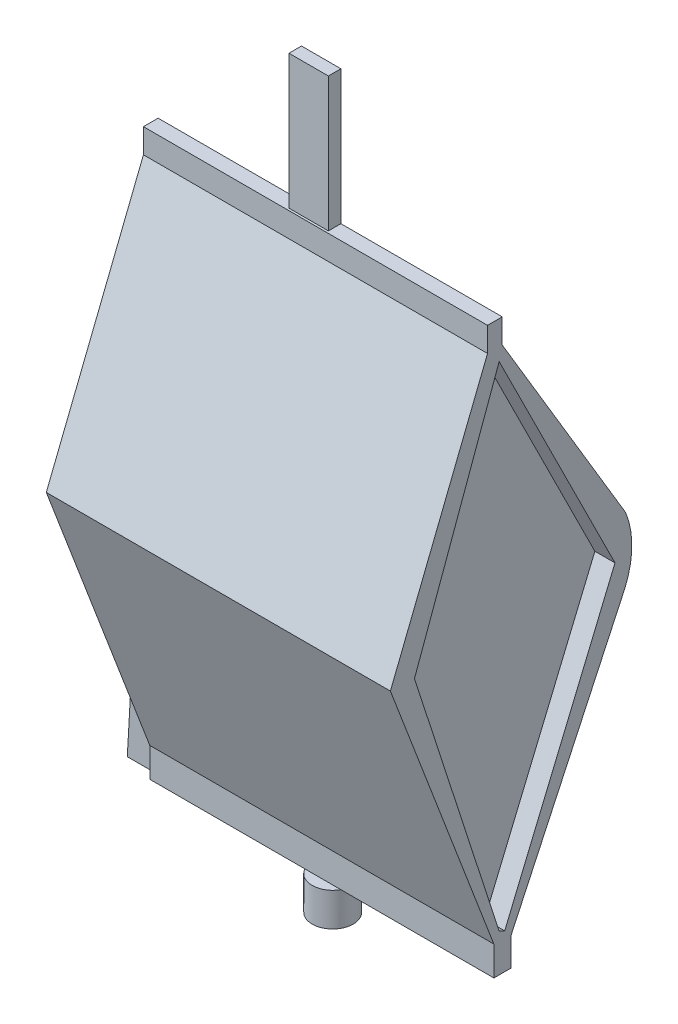
ISO-10303-21;
HEADER;
FILE_DESCRIPTION(('STEP AP214'),'2;1');
FILE_NAME('part.step','',(''),(''),'','','');
FILE_SCHEMA(('AUTOMOTIVE_DESIGN { 1 0 10303 214 1 1 1 1 }'));
ENDSEC;
DATA;
#1=APPLICATION_CONTEXT('core data for automotive mechanical design processes');
#2=APPLICATION_PROTOCOL_DEFINITION('international standard','automotive_design',2000,#1);
#3=PRODUCT_CONTEXT('',#1,'mechanical');
#4=PRODUCT('Part','Part','',(#3));
#5=PRODUCT_RELATED_PRODUCT_CATEGORY('part','',(#4));
#6=PRODUCT_DEFINITION_FORMATION('','',#4);
#7=PRODUCT_DEFINITION_CONTEXT('part definition',#1,'design');
#8=PRODUCT_DEFINITION('design','',#6,#7);
#9=PRODUCT_DEFINITION_SHAPE('','',#8);
#10=(LENGTH_UNIT() NAMED_UNIT(*) SI_UNIT(.MILLI.,.METRE.));
#11=(NAMED_UNIT(*) PLANE_ANGLE_UNIT() SI_UNIT($,.RADIAN.));
#12=(NAMED_UNIT(*) SI_UNIT($,.STERADIAN.) SOLID_ANGLE_UNIT());
#13=UNCERTAINTY_MEASURE_WITH_UNIT(LENGTH_MEASURE(1.E-05),#10,'distance_accuracy_value','');
#14=(GEOMETRIC_REPRESENTATION_CONTEXT(3) GLOBAL_UNCERTAINTY_ASSIGNED_CONTEXT((#13)) GLOBAL_UNIT_ASSIGNED_CONTEXT((#10,
#11,#12)) REPRESENTATION_CONTEXT('',''));
#15=CARTESIAN_POINT('',(0.,0.,0.));
#16=DIRECTION('',(0.,0.,1.));
#17=DIRECTION('',(1.,0.,0.));
#18=AXIS2_PLACEMENT_3D('',#15,#16,#17);
#19=CARTESIAN_POINT('',(-10.1405450074318,-16.383261510201,37.0439177567727));
#20=DIRECTION('',(0.,1.,0.));
#21=DIRECTION('',(0.,0.,1.));
#22=AXIS2_PLACEMENT_3D('',#19,#20,#21);
#23=PLANE('',#22);
#24=CARTESIAN_POINT('',(4.79777891586508,-16.383261510201,28.8175561612292));
#25=DIRECTION('',(0.,-1.,0.));
#26=DIRECTION('',(0.,0.,-1.));
#27=AXIS2_PLACEMENT_3D('',#24,#25,#26);
#28=CIRCLE('',#27,1.22111887593082);
#29=CARTESIAN_POINT('',(5.93599677635128,-16.383261510201,28.3752989835319));
#30=VERTEX_POINT('',#29);
#31=CARTESIAN_POINT('',(5.86924766810465,-16.383261510201,29.4032916152771));
#32=VERTEX_POINT('',#31);
#33=EDGE_CURVE('E44',#30,#32,#28,.T.);
#34=ORIENTED_EDGE('',*,*,#33,.F.);
#35=DIRECTION('',(1.,0.,0.));
#36=VECTOR('',#35,1.);
#37=CARTESIAN_POINT('',(-10.1405450074318,-16.383261510201,28.3752989835319));
#38=LINE('',#37,#36);
#39=CARTESIAN_POINT('',(14.9939474205773,-16.383261510201,28.3752989835319));
#40=VERTEX_POINT('',#39);
#41=EDGE_CURVE('E198',#30,#40,#38,.T.);
#42=ORIENTED_EDGE('',*,*,#41,.T.);
#43=DIRECTION('',(0.,0.,-1.));
#44=VECTOR('',#43,1.);
#45=CARTESIAN_POINT('',(14.9939474205773,-16.383261510201,37.0439177567727));
#46=LINE('',#45,#44);
#47=CARTESIAN_POINT('',(14.9939474205773,-16.383261510201,29.4032916152771));
#48=VERTEX_POINT('',#47);
#49=EDGE_CURVE('E358',#48,#40,#46,.T.);
#50=ORIENTED_EDGE('',*,*,#49,.F.);
#51=DIRECTION('',(1.,0.,0.));
#52=VECTOR('',#51,1.);
#53=CARTESIAN_POINT('',(-17.0060525794227,-16.383261510201,29.4032916152771));
#54=LINE('',#53,#52);
#55=EDGE_CURVE('E52',#32,#48,#54,.T.);
#56=ORIENTED_EDGE('',*,*,#55,.F.);
#57=EDGE_LOOP('',(#34,#42,#50,#56));
#58=FACE_BOUND('',#57,.T.);
#59=ADVANCED_FACE('F34',(#58),#23,.F.);
#60=CARTESIAN_POINT('',(-10.1405450074318,17.5056411192811,37.0439177567727));
#61=DIRECTION('',(0.,-1.,0.));
#62=DIRECTION('',(0.,0.,-1.));
#63=AXIS2_PLACEMENT_3D('',#60,#61,#62);
#64=PLANE('',#63);
#65=DIRECTION('',(0.,0.,1.));
#66=VECTOR('',#65,1.);
#67=CARTESIAN_POINT('',(3.02748880821108,17.5056411192811,29.6523771630587));
#68=LINE('',#67,#66);
#69=CARTESIAN_POINT('',(3.02748880821108,17.5056411192811,28.9060713444781));
#70=VERTEX_POINT('',#69);
#71=CARTESIAN_POINT('',(3.02748880821108,17.5056411192811,29.6523771630587));
#72=VERTEX_POINT('',#71);
#73=EDGE_CURVE('E229',#70,#72,#68,.T.);
#74=ORIENTED_EDGE('',*,*,#73,.F.);
#75=DIRECTION('',(1.,0.,0.));
#76=VECTOR('',#75,1.);
#77=CARTESIAN_POINT('',(-17.0060525794227,17.5056411192811,28.9060713444781));
#78=LINE('',#77,#76);
#79=CARTESIAN_POINT('',(-5.52126211458491,17.5056411192811,28.9060713444781));
#80=VERTEX_POINT('',#79);
#81=EDGE_CURVE('E341',#80,#70,#78,.T.);
#82=ORIENTED_EDGE('',*,*,#81,.F.);
#83=DIRECTION('',(0.,0.,-1.));
#84=VECTOR('',#83,1.);
#85=CARTESIAN_POINT('',(-5.52126211458491,17.5056411192811,60.9060713444781));
#86=LINE('',#85,#84);
#87=CARTESIAN_POINT('',(-5.52126211458491,17.5056411192811,29.7823314594479));
#88=VERTEX_POINT('',#87);
#89=EDGE_CURVE('E265',#88,#80,#86,.T.);
#90=ORIENTED_EDGE('',*,*,#89,.F.);
#91=DIRECTION('',(1.,0.,0.));
#92=VECTOR('',#91,1.);
#93=CARTESIAN_POINT('',(-17.0060525794227,17.5056411192811,29.7823314594479));
#94=LINE('',#93,#92);
#95=CARTESIAN_POINT('',(14.9939474205773,17.5056411192811,29.7823314594479));
#96=VERTEX_POINT('',#95);
#97=EDGE_CURVE('E364',#88,#96,#94,.T.);
#98=ORIENTED_EDGE('',*,*,#97,.T.);
#99=DIRECTION('',(0.,0.,-1.));
#100=VECTOR('',#99,1.);
#101=CARTESIAN_POINT('',(14.9939474205773,17.5056411192811,37.0439177567727));
#102=LINE('',#101,#100);
#103=CARTESIAN_POINT('',(14.9939474205773,17.5056411192811,28.9060713444781));
#104=VERTEX_POINT('',#103);
#105=EDGE_CURVE('E369',#96,#104,#102,.T.);
#106=ORIENTED_EDGE('',*,*,#105,.T.);
#107=CARTESIAN_POINT('',(5.37584407242301,17.5056411192811,28.9060713444781));
#108=VERTEX_POINT('',#107);
#109=EDGE_CURVE('E335',#108,#104,#78,.T.);
#110=ORIENTED_EDGE('',*,*,#109,.F.);
#111=DIRECTION('',(0.,0.,-1.));
#112=VECTOR('',#111,1.);
#113=CARTESIAN_POINT('',(5.37584407242301,17.5056411192811,29.6523771630587));
#114=LINE('',#113,#112);
#115=CARTESIAN_POINT('',(5.37584407242301,17.5056411192811,29.6523771630587));
#116=VERTEX_POINT('',#115);
#117=EDGE_CURVE('E222',#116,#108,#114,.T.);
#118=ORIENTED_EDGE('',*,*,#117,.F.);
#119=DIRECTION('',(1.,0.,0.));
#120=VECTOR('',#119,1.);
#121=CARTESIAN_POINT('',(5.37584407242301,17.5056411192811,29.6523771630587));
#122=LINE('',#121,#120);
#123=EDGE_CURVE('E232',#72,#116,#122,.T.);
#124=ORIENTED_EDGE('',*,*,#123,.F.);
#125=EDGE_LOOP('',(#74,#82,#90,#98,#106,#110,#118,#124));
#126=FACE_BOUND('',#125,.T.);
#127=ADVANCED_FACE('F396',(#126),#64,.F.);
#128=CARTESIAN_POINT('',(14.9939474205773,17.5056411192811,37.0439177567727));
#129=DIRECTION('',(-1.,0.,0.));
#130=DIRECTION('',(0.,0.,1.));
#131=AXIS2_PLACEMENT_3D('',#128,#129,#130);
#132=PLANE('',#131);
#133=DIRECTION('',(0.,-0.939498101775437,0.34255410778496));
#134=VECTOR('',#133,1.);
#135=CARTESIAN_POINT('',(14.9939474205773,15.2881641035008,29.0885573251257));
#136=LINE('',#135,#134);
#137=CARTESIAN_POINT('',(14.9939474205773,15.2881641035008,29.0885573251257));
#138=VERTEX_POINT('',#137);
#139=CARTESIAN_POINT('',(14.9939474205773,1.43957116866305,34.1379474068146));
#140=VERTEX_POINT('',#139);
#141=EDGE_CURVE('E299',#138,#140,#136,.T.);
#142=ORIENTED_EDGE('',*,*,#141,.F.);
#143=DIRECTION('',(0.,0.894888871151744,0.446289041192766));
#144=VECTOR('',#143,1.);
#145=CARTESIAN_POINT('',(14.9939474205773,1.43957116866305,22.1821408280659));
#146=LINE('',#145,#144);
#147=CARTESIAN_POINT('',(14.9939474205773,1.43957116866305,22.1821408280659));
#148=VERTEX_POINT('',#147);
#149=EDGE_CURVE('E280',#148,#138,#146,.T.);
#150=ORIENTED_EDGE('',*,*,#149,.F.);
#151=DIRECTION('',(0.,0.922414525454659,-0.386201298845896));
#152=VECTOR('',#151,1.);
#153=CARTESIAN_POINT('',(14.9939474205773,-14.2700907355062,28.7595435731382));
#154=LINE('',#153,#152);
#155=CARTESIAN_POINT('',(14.9939474205773,-14.2700907355062,28.7595435731382));
#156=VERTEX_POINT('',#155);
#157=EDGE_CURVE('E285',#156,#148,#154,.T.);
#158=ORIENTED_EDGE('',*,*,#157,.F.);
#159=DIRECTION('',(0.,-0.423128591443833,-0.906069641419884));
#160=VECTOR('',#159,1.);
#161=CARTESIAN_POINT('',(14.9939474205773,-14.1164434670402,29.0885573251257));
#162=LINE('',#161,#160);
#163=CARTESIAN_POINT('',(14.9939474205773,-14.1164434670402,29.0885573251257));
#164=VERTEX_POINT('',#163);
#165=EDGE_CURVE('E305',#164,#156,#162,.T.);
#166=ORIENTED_EDGE('',*,*,#165,.F.);
#167=DIRECTION('',(0.,-0.951147499434773,-0.308736836673207));
#168=VECTOR('',#167,1.);
#169=CARTESIAN_POINT('',(14.9939474205773,1.43957116866305,34.1379474068146));
#170=LINE('',#169,#168);
#171=EDGE_CURVE('E302',#140,#164,#170,.T.);
#172=ORIENTED_EDGE('',*,*,#171,.F.);
#173=EDGE_LOOP('',(#142,#150,#158,#166,#172));
#174=FACE_BOUND('',#173,.T.);
#175=DIRECTION('',(0.,-0.906069641419884,0.423128591443834));
#176=VECTOR('',#175,1.);
#177=CARTESIAN_POINT('',(14.9939474205773,2.06125335554348,20.5544841655735));
#178=LINE('',#177,#176);
#179=CARTESIAN_POINT('',(14.9939474205773,-0.14556183020964,21.5850524115874));
#180=VERTEX_POINT('',#179);
#181=CARTESIAN_POINT('',(14.9939474205773,-14.6859081953666,28.3752989835319));
#182=VERTEX_POINT('',#181);
#183=EDGE_CURVE('E330',#180,#182,#178,.T.);
#184=ORIENTED_EDGE('',*,*,#183,.F.);
#185=CARTESIAN_POINT('',(14.9939474205773,1.83319011203404,26.222220961359));
#186=DIRECTION('',(-1.,0.,0.));
#187=DIRECTION('',(0.,0.,1.));
#188=AXIS2_PLACEMENT_3D('',#185,#186,#187);
#189=CIRCLE('',#188,5.04170520835203);
#190=CARTESIAN_POINT('',(14.9939474205773,3.73098867829226,21.5513375320887));
#191=VERTEX_POINT('',#190);
#192=EDGE_CURVE('E312',#180,#191,#189,.F.);
#193=ORIENTED_EDGE('',*,*,#192,.T.);
#194=DIRECTION('',(0.,-0.85862241369767,-0.512608574543957));
#195=VECTOR('',#194,1.);
#196=CARTESIAN_POINT('',(14.9939474205773,16.0502115935854,28.9060713444781));
#197=LINE('',#196,#195);
#198=CARTESIAN_POINT('',(14.9939474205773,16.0502115935854,28.9060713444781));
#199=VERTEX_POINT('',#198);
#200=EDGE_CURVE('E328',#199,#191,#197,.T.);
#201=ORIENTED_EDGE('',*,*,#200,.F.);
#202=DIRECTION('',(0.,-1.,0.));
#203=VECTOR('',#202,1.);
#204=CARTESIAN_POINT('',(14.9939474205773,17.5056411192811,28.9060713444781));
#205=LINE('',#204,#203);
#206=EDGE_CURVE('E325',#104,#199,#205,.T.);
#207=ORIENTED_EDGE('',*,*,#206,.F.);
#208=ORIENTED_EDGE('',*,*,#105,.F.);
#209=DIRECTION('',(0.,-1.,0.));
#210=VECTOR('',#209,1.);
#211=CARTESIAN_POINT('',(14.9939474205773,0.561189804540035,29.7823314594479));
#212=LINE('',#211,#210);
#213=CARTESIAN_POINT('',(14.9939474205773,16.0524594077059,29.7823314594479));
#214=VERTEX_POINT('',#213);
#215=EDGE_CURVE('E346',#96,#214,#212,.T.);
#216=ORIENTED_EDGE('',*,*,#215,.T.);
#217=DIRECTION('',(0.,-0.928999989043887,0.370079748644069));
#218=VECTOR('',#217,1.);
#219=CARTESIAN_POINT('',(14.9939474205773,7.06237754820204,33.3636525295148));
#220=LINE('',#219,#218);
#221=CARTESIAN_POINT('',(14.9939474205773,1.51675664046694,35.5728258511659));
#222=VERTEX_POINT('',#221);
#223=EDGE_CURVE('E338',#214,#222,#220,.T.);
#224=ORIENTED_EDGE('',*,*,#223,.T.);
#225=DIRECTION('',(0.,-0.934146484006521,-0.356889823920849));
#226=VECTOR('',#225,1.);
#227=CARTESIAN_POINT('',(14.9939474205773,-5.49440333280213,32.8942184901351));
#228=LINE('',#227,#226);
#229=CARTESIAN_POINT('',(14.9939474205773,-14.6317808860375,29.4032916152771));
#230=VERTEX_POINT('',#229);
#231=EDGE_CURVE('E352',#222,#230,#228,.T.);
#232=ORIENTED_EDGE('',*,*,#231,.T.);
#233=DIRECTION('',(0.,-1.,0.));
#234=VECTOR('',#233,1.);
#235=CARTESIAN_POINT('',(14.9939474205773,0.561189804540035,29.4032916152771));
#236=LINE('',#235,#234);
#237=EDGE_CURVE('E349',#230,#48,#236,.T.);
#238=ORIENTED_EDGE('',*,*,#237,.T.);
#239=ORIENTED_EDGE('',*,*,#49,.T.);
#240=DIRECTION('',(0.,-1.,0.));
#241=VECTOR('',#240,1.);
#242=CARTESIAN_POINT('',(14.9939474205773,-14.6859081953666,28.3752989835319));
#243=LINE('',#242,#241);
#244=EDGE_CURVE('E333',#182,#40,#243,.T.);
#245=ORIENTED_EDGE('',*,*,#244,.F.);
#246=EDGE_LOOP('',(#184,#193,#201,#207,#208,#216,#224,#232,#238,#239,#245));
#247=FACE_BOUND('',#246,.T.);
#248=ADVANCED_FACE('F36',(#174,#247),#132,.F.);
#249=CARTESIAN_POINT('',(3.72631016362551,-16.383261510201,29.4032916152771));
#250=VERTEX_POINT('',#249);
#251=CARTESIAN_POINT('',(3.65956105537888,-16.383261510201,28.3752989835319));
#252=VERTEX_POINT('',#251);
#253=EDGE_CURVE('E11',#250,#252,#28,.T.);
#254=ORIENTED_EDGE('',*,*,#253,.F.);
#255=CARTESIAN_POINT('',(-5.52126211458491,-16.383261510201,29.4032916152771));
#256=VERTEX_POINT('',#255);
#257=EDGE_CURVE('E361',#256,#250,#54,.T.);
#258=ORIENTED_EDGE('',*,*,#257,.F.);
#259=DIRECTION('',(0.,0.,-1.));
#260=VECTOR('',#259,1.);
#261=CARTESIAN_POINT('',(-5.52126211458491,-16.383261510201,37.0439177567727));
#262=LINE('',#261,#260);
#263=CARTESIAN_POINT('',(-5.52126211458491,-16.383261510201,28.9060713444781));
#264=VERTEX_POINT('',#263);
#265=EDGE_CURVE('E273',#256,#264,#262,.T.);
#266=ORIENTED_EDGE('',*,*,#265,.T.);
#267=DIRECTION('',(1.,0.,0.));
#268=VECTOR('',#267,1.);
#269=CARTESIAN_POINT('',(-10.1405450074318,-16.383261510201,28.9060713444781));
#270=LINE('',#269,#268);
#271=CARTESIAN_POINT('',(-7.35894796984782,-16.383261510201,28.9060713444781));
#272=VERTEX_POINT('',#271);
#273=EDGE_CURVE('E278',#272,#264,#270,.T.);
#274=ORIENTED_EDGE('',*,*,#273,.F.);
#275=DIRECTION('',(-0.0338075057725634,0.,-0.999428362892228));
#276=VECTOR('',#275,1.);
#277=CARTESIAN_POINT('',(-7.08716416848602,-16.383261510201,36.940631524191));
#278=LINE('',#277,#276);
#279=CARTESIAN_POINT('',(-7.37690232287886,-16.383261510201,28.3752989835319));
#280=VERTEX_POINT('',#279);
#281=EDGE_CURVE('E194',#272,#280,#278,.T.);
#282=ORIENTED_EDGE('',*,*,#281,.T.);
#283=EDGE_CURVE('E190',#280,#252,#38,.T.);
#284=ORIENTED_EDGE('',*,*,#283,.T.);
#285=EDGE_LOOP('',(#254,#258,#266,#274,#282,#284));
#286=FACE_BOUND('',#285,.T.);
#287=ADVANCED_FACE('F192',(#286),#23,.F.);
#288=CARTESIAN_POINT('',(-17.0060525794227,7.06237754820204,33.3636525295148));
#289=DIRECTION('',(0.,0.370079748644069,0.928999989043887));
#290=DIRECTION('',(0.,-0.928999989043887,0.370079748644069));
#291=AXIS2_PLACEMENT_3D('',#288,#289,#290);
#292=PLANE('',#291);
#293=DIRECTION('',(0.,0.928999989043887,-0.370079748644069));
#294=VECTOR('',#293,1.);
#295=CARTESIAN_POINT('',(-5.52126211458491,7.06237754820204,33.3636525295148));
#296=LINE('',#295,#294);
#297=CARTESIAN_POINT('',(-5.52126211458491,1.51675664046694,35.5728258511659));
#298=VERTEX_POINT('',#297);
#299=CARTESIAN_POINT('',(-5.52126211458491,16.0524594077059,29.7823314594479));
#300=VERTEX_POINT('',#299);
#301=EDGE_CURVE('E271',#298,#300,#296,.T.);
#302=ORIENTED_EDGE('',*,*,#301,.F.);
#303=DIRECTION('',(1.,0.,0.));
#304=VECTOR('',#303,1.);
#305=CARTESIAN_POINT('',(-17.0060525794227,1.51675664046694,35.5728258511659));
#306=LINE('',#305,#304);
#307=EDGE_CURVE('E356',#298,#222,#306,.T.);
#308=ORIENTED_EDGE('',*,*,#307,.T.);
#309=ORIENTED_EDGE('',*,*,#223,.F.);
#310=DIRECTION('',(1.,0.,0.));
#311=VECTOR('',#310,1.);
#312=CARTESIAN_POINT('',(-17.0060525794227,16.0524594077059,29.7823314594479));
#313=LINE('',#312,#311);
#314=EDGE_CURVE('E355',#300,#214,#313,.T.);
#315=ORIENTED_EDGE('',*,*,#314,.F.);
#316=EDGE_LOOP('',(#302,#308,#309,#315));
#317=FACE_BOUND('',#316,.T.);
#318=ADVANCED_FACE('F403',(#317),#292,.T.);
#319=CARTESIAN_POINT('',(-17.0060525794227,-5.49440333280213,32.8942184901351));
#320=DIRECTION('',(0.,-0.356889823920849,0.934146484006521));
#321=DIRECTION('',(0.,-0.934146484006521,-0.356889823920849));
#322=AXIS2_PLACEMENT_3D('',#319,#320,#321);
#323=PLANE('',#322);
#324=DIRECTION('',(0.,0.934146484006521,0.356889823920849));
#325=VECTOR('',#324,1.);
#326=CARTESIAN_POINT('',(-5.52126211458491,-5.49440333280213,32.8942184901351));
#327=LINE('',#326,#325);
#328=CARTESIAN_POINT('',(-5.52126211458491,-14.6317808860375,29.4032916152771));
#329=VERTEX_POINT('',#328);
#330=EDGE_CURVE('E269',#329,#298,#327,.T.);
#331=ORIENTED_EDGE('',*,*,#330,.F.);
#332=DIRECTION('',(1.,0.,0.));
#333=VECTOR('',#332,1.);
#334=CARTESIAN_POINT('',(-17.0060525794227,-14.6317808860375,29.4032916152771));
#335=LINE('',#334,#333);
#336=EDGE_CURVE('E359',#329,#230,#335,.T.);
#337=ORIENTED_EDGE('',*,*,#336,.T.);
#338=ORIENTED_EDGE('',*,*,#231,.F.);
#339=ORIENTED_EDGE('',*,*,#307,.F.);
#340=EDGE_LOOP('',(#331,#337,#338,#339));
#341=FACE_BOUND('',#340,.T.);
#342=ADVANCED_FACE('F408',(#341),#323,.T.);
#343=CARTESIAN_POINT('',(-17.0060525794227,0.561189804540035,29.7823314594479));
#344=DIRECTION('',(0.,0.,1.));
#345=DIRECTION('',(1.,0.,0.));
#346=AXIS2_PLACEMENT_3D('',#343,#344,#345);
#347=PLANE('',#346);
#348=DIRECTION('',(0.,1.,0.));
#349=VECTOR('',#348,1.);
#350=CARTESIAN_POINT('',(-5.52126211458491,0.561189804540035,29.7823314594479));
#351=LINE('',#350,#349);
#352=EDGE_CURVE('E276',#300,#88,#351,.T.);
#353=ORIENTED_EDGE('',*,*,#352,.F.);
#354=ORIENTED_EDGE('',*,*,#314,.T.);
#355=ORIENTED_EDGE('',*,*,#215,.F.);
#356=ORIENTED_EDGE('',*,*,#97,.F.);
#357=EDGE_LOOP('',(#353,#354,#355,#356));
#358=FACE_BOUND('',#357,.T.);
#359=ADVANCED_FACE('F476',(#358),#347,.T.);
#360=CARTESIAN_POINT('',(-17.0060525794227,0.561189804540035,29.4032916152771));
#361=DIRECTION('',(0.,0.,1.));
#362=DIRECTION('',(1.,0.,0.));
#363=AXIS2_PLACEMENT_3D('',#360,#361,#362);
#364=PLANE('',#363);
#365=DIRECTION('',(0.,1.,0.));
#366=VECTOR('',#365,1.);
#367=CARTESIAN_POINT('',(-5.52126211458491,0.561189804540035,29.4032916152771));
#368=LINE('',#367,#366);
#369=EDGE_CURVE('E267',#256,#329,#368,.T.);
#370=ORIENTED_EDGE('',*,*,#369,.F.);
#371=ORIENTED_EDGE('',*,*,#257,.T.);
#372=EDGE_CURVE('E363',#250,#32,#54,.T.);
#373=ORIENTED_EDGE('',*,*,#372,.T.);
#374=ORIENTED_EDGE('',*,*,#55,.T.);
#375=ORIENTED_EDGE('',*,*,#237,.F.);
#376=ORIENTED_EDGE('',*,*,#336,.F.);
#377=EDGE_LOOP('',(#370,#371,#373,#374,#375,#376));
#378=FACE_BOUND('',#377,.T.);
#379=ADVANCED_FACE('F382',(#378),#364,.T.);
#380=CARTESIAN_POINT('',(-17.0060525794227,2.06125335554348,20.5544841655735));
#381=DIRECTION('',(0.,0.423128591443834,0.906069641419884));
#382=DIRECTION('',(0.,-0.906069641419884,0.423128591443834));
#383=AXIS2_PLACEMENT_3D('',#380,#381,#382);
#384=PLANE('',#383);
#385=DIRECTION('',(1.,0.,0.));
#386=VECTOR('',#385,1.);
#387=CARTESIAN_POINT('',(-17.0060525794227,-14.6859081953666,28.3752989835319));
#388=LINE('',#387,#386);
#389=CARTESIAN_POINT('',(-7.28073000830517,-14.6859081953666,28.3752989835319));
#390=VERTEX_POINT('',#389);
#391=EDGE_CURVE('E336',#390,#182,#388,.T.);
#392=ORIENTED_EDGE('',*,*,#391,.F.);
#393=DIRECTION('',(0.0369995971802615,0.905449237853405,-0.422838867039427));
#394=VECTOR('',#393,1.);
#395=CARTESIAN_POINT('',(-6.61063710719091,1.71251645906622,20.7173420134092));
#396=LINE('',#395,#394);
#397=CARTESIAN_POINT('',(-6.68656422199591,-0.14556183020964,21.5850524115874));
#398=VERTEX_POINT('',#397);
#399=EDGE_CURVE('E255',#390,#398,#396,.T.);
#400=ORIENTED_EDGE('',*,*,#399,.T.);
#401=DIRECTION('',(-1.,0.,0.));
#402=VECTOR('',#401,1.);
#403=CARTESIAN_POINT('',(21.8594549925682,-0.145561830209663,21.5850524115874));
#404=LINE('',#403,#402);
#405=EDGE_CURVE('E323',#398,#180,#404,.F.);
#406=ORIENTED_EDGE('',*,*,#405,.T.);
#407=ORIENTED_EDGE('',*,*,#183,.T.);
#408=EDGE_LOOP('',(#392,#400,#406,#407));
#409=FACE_BOUND('',#408,.T.);
#410=ADVANCED_FACE('F463',(#409),#384,.F.);
#411=CARTESIAN_POINT('',(-17.0060525794227,16.0502115935854,28.9060713444781));
#412=DIRECTION('',(0.,-0.512608574543957,0.85862241369767));
#413=DIRECTION('',(0.,-0.85862241369767,-0.512608574543957));
#414=AXIS2_PLACEMENT_3D('',#411,#412,#413);
#415=PLANE('',#414);
#416=DIRECTION('',(-1.,0.,0.));
#417=VECTOR('',#416,1.);
#418=CARTESIAN_POINT('',(21.8594549925682,3.73098867829226,21.5513375320887));
#419=LINE('',#418,#417);
#420=CARTESIAN_POINT('',(-6.46805870830965,3.73098867829221,21.5513375320887));
#421=VERTEX_POINT('',#420);
#422=EDGE_CURVE('E38',#191,#421,#419,.T.);
#423=ORIENTED_EDGE('',*,*,#422,.T.);
#424=DIRECTION('',(-0.0658464023478479,-0.856759006178959,-0.511496096396726));
#425=VECTOR('',#424,1.);
#426=CARTESIAN_POINT('',(-5.52126211458491,16.0502115935854,28.9060713444781));
#427=LINE('',#426,#425);
#428=CARTESIAN_POINT('',(-5.52126211458491,16.0502115935854,28.9060713444781));
#429=VERTEX_POINT('',#428);
#430=EDGE_CURVE('E248',#429,#421,#427,.T.);
#431=ORIENTED_EDGE('',*,*,#430,.F.);
#432=DIRECTION('',(1.,0.,0.));
#433=VECTOR('',#432,1.);
#434=CARTESIAN_POINT('',(-17.0060525794227,16.0502115935854,28.9060713444781));
#435=LINE('',#434,#433);
#436=EDGE_CURVE('E339',#429,#199,#435,.T.);
#437=ORIENTED_EDGE('',*,*,#436,.T.);
#438=ORIENTED_EDGE('',*,*,#200,.T.);
#439=EDGE_LOOP('',(#423,#431,#437,#438));
#440=FACE_BOUND('',#439,.T.);
#441=ADVANCED_FACE('F466',(#440),#415,.F.);
#442=CARTESIAN_POINT('',(-17.0060525794227,17.5056411192811,28.9060713444781));
#443=DIRECTION('',(0.,0.,1.));
#444=DIRECTION('',(1.,0.,0.));
#445=AXIS2_PLACEMENT_3D('',#442,#443,#444);
#446=PLANE('',#445);
#447=ORIENTED_EDGE('',*,*,#436,.F.);
#448=DIRECTION('',(0.,-1.,0.));
#449=VECTOR('',#448,1.);
#450=CARTESIAN_POINT('',(-5.52126211458491,-16.2627138738118,28.9060713444781));
#451=LINE('',#450,#449);
#452=EDGE_CURVE('E262',#80,#429,#451,.T.);
#453=ORIENTED_EDGE('',*,*,#452,.F.);
#454=ORIENTED_EDGE('',*,*,#81,.T.);
#455=DIRECTION('',(0.,-1.,0.));
#456=VECTOR('',#455,1.);
#457=CARTESIAN_POINT('',(3.02748880821108,25.5056411192811,28.9060713444781));
#458=LINE('',#457,#456);
#459=CARTESIAN_POINT('',(3.02748880821108,25.5056411192811,28.9060713444781));
#460=VERTEX_POINT('',#459);
#461=EDGE_CURVE('E228',#460,#70,#458,.T.);
#462=ORIENTED_EDGE('',*,*,#461,.F.);
#463=DIRECTION('',(-1.,0.,0.));
#464=VECTOR('',#463,1.);
#465=CARTESIAN_POINT('',(5.37584407242301,25.5056411192811,28.9060713444781));
#466=LINE('',#465,#464);
#467=CARTESIAN_POINT('',(5.37584407242301,25.5056411192811,28.9060713444781));
#468=VERTEX_POINT('',#467);
#469=EDGE_CURVE('E226',#468,#460,#466,.T.);
#470=ORIENTED_EDGE('',*,*,#469,.F.);
#471=DIRECTION('',(0.,-1.,0.));
#472=VECTOR('',#471,1.);
#473=CARTESIAN_POINT('',(5.37584407242301,25.5056411192811,28.9060713444781));
#474=LINE('',#473,#472);
#475=EDGE_CURVE('E239',#468,#108,#474,.T.);
#476=ORIENTED_EDGE('',*,*,#475,.T.);
#477=ORIENTED_EDGE('',*,*,#109,.T.);
#478=ORIENTED_EDGE('',*,*,#206,.T.);
#479=EDGE_LOOP('',(#447,#453,#454,#462,#470,#476,#477,#478));
#480=FACE_BOUND('',#479,.T.);
#481=ADVANCED_FACE('F462',(#480),#446,.F.);
#482=CARTESIAN_POINT('',(-17.0060525794227,-14.6859081953666,28.3752989835319));
#483=DIRECTION('',(0.,0.,1.));
#484=DIRECTION('',(1.,0.,0.));
#485=AXIS2_PLACEMENT_3D('',#482,#483,#484);
#486=PLANE('',#485);
#487=ORIENTED_EDGE('',*,*,#283,.F.);
#488=DIRECTION('',(0.0565694307091629,0.998398667621928,0.));
#489=VECTOR('',#488,1.);
#490=CARTESIAN_POINT('',(-7.31185201783779,-15.2351831741238,28.3752989835319));
#491=LINE('',#490,#489);
#492=EDGE_CURVE('E253',#280,#390,#491,.T.);
#493=ORIENTED_EDGE('',*,*,#492,.T.);
#494=ORIENTED_EDGE('',*,*,#391,.T.);
#495=ORIENTED_EDGE('',*,*,#244,.T.);
#496=ORIENTED_EDGE('',*,*,#41,.F.);
#497=EDGE_CURVE('E197',#252,#30,#38,.T.);
#498=ORIENTED_EDGE('',*,*,#497,.F.);
#499=EDGE_LOOP('',(#487,#493,#494,#495,#496,#498));
#500=FACE_BOUND('',#499,.T.);
#501=ADVANCED_FACE('F202',(#500),#486,.F.);
#502=CARTESIAN_POINT('',(21.8594549925682,1.83319011203404,26.222220961359));
#503=DIRECTION('',(-1.,0.,0.));
#504=DIRECTION('',(0.,0.,1.));
#505=AXIS2_PLACEMENT_3D('',#502,#503,#504);
#506=CYLINDRICAL_SURFACE('',#505,5.04170520835203);
#507=ORIENTED_EDGE('',*,*,#405,.F.);
#508=CARTESIAN_POINT('',(-6.41758704552505,1.83319011203404,26.222220961359));
#509=DIRECTION('',(0.997829770701318,-0.0565371969172171,-0.0337534304463782));
#510=DIRECTION('',(-0.0658464023478479,-0.856759006178959,-0.511496096396726));
#511=AXIS2_PLACEMENT_3D('',#508,#509,#510);
#512=ELLIPSE('',#511,5.05267066225985,5.04170520835203);
#513=EDGE_CURVE('E258',#398,#421,#512,.T.);
#514=ORIENTED_EDGE('',*,*,#513,.T.);
#515=ORIENTED_EDGE('',*,*,#422,.F.);
#516=ORIENTED_EDGE('',*,*,#192,.F.);
#517=EDGE_LOOP('',(#507,#514,#515,#516));
#518=FACE_BOUND('',#517,.T.);
#519=ADVANCED_FACE('F456',(#518),#506,.T.);
#520=CARTESIAN_POINT('',(13.7939474205773,1.43957116866305,22.1821408280659));
#521=DIRECTION('',(0.,0.446289041192766,-0.894888871151744));
#522=DIRECTION('',(0.,0.894888871151744,0.446289041192766));
#523=AXIS2_PLACEMENT_3D('',#520,#521,#522);
#524=PLANE('',#523);
#525=ORIENTED_EDGE('',*,*,#149,.T.);
#526=DIRECTION('',(1.,0.,0.));
#527=VECTOR('',#526,1.);
#528=CARTESIAN_POINT('',(13.7939474205773,15.2881641035008,29.0885573251257));
#529=LINE('',#528,#527);
#530=CARTESIAN_POINT('',(13.7939474205773,15.2881641035008,29.0885573251257));
#531=VERTEX_POINT('',#530);
#532=EDGE_CURVE('E297',#531,#138,#529,.T.);
#533=ORIENTED_EDGE('',*,*,#532,.F.);
#534=DIRECTION('',(0.,0.894888871151744,0.446289041192766));
#535=VECTOR('',#534,1.);
#536=CARTESIAN_POINT('',(13.7939474205773,1.43957116866305,22.1821408280659));
#537=LINE('',#536,#535);
#538=CARTESIAN_POINT('',(13.7939474205773,1.43957116866305,22.1821408280659));
#539=VERTEX_POINT('',#538);
#540=EDGE_CURVE('E281',#539,#531,#537,.T.);
#541=ORIENTED_EDGE('',*,*,#540,.F.);
#542=DIRECTION('',(1.,0.,0.));
#543=VECTOR('',#542,1.);
#544=CARTESIAN_POINT('',(13.7939474205773,1.43957116866305,22.1821408280659));
#545=LINE('',#544,#543);
#546=EDGE_CURVE('E310',#539,#148,#545,.T.);
#547=ORIENTED_EDGE('',*,*,#546,.T.);
#548=EDGE_LOOP('',(#525,#533,#541,#547));
#549=FACE_BOUND('',#548,.T.);
#550=ADVANCED_FACE('F424',(#549),#524,.F.);
#551=CARTESIAN_POINT('',(13.7939474205773,-14.2700907355062,28.7595435731382));
#552=DIRECTION('',(0.,-0.386201298845896,-0.922414525454659));
#553=DIRECTION('',(0.,0.922414525454659,-0.386201298845896));
#554=AXIS2_PLACEMENT_3D('',#551,#552,#553);
#555=PLANE('',#554);
#556=ORIENTED_EDGE('',*,*,#157,.T.);
#557=ORIENTED_EDGE('',*,*,#546,.F.);
#558=DIRECTION('',(0.,0.922414525454659,-0.386201298845896));
#559=VECTOR('',#558,1.);
#560=CARTESIAN_POINT('',(13.7939474205773,-14.2700907355062,28.7595435731382));
#561=LINE('',#560,#559);
#562=CARTESIAN_POINT('',(13.7939474205773,-14.2700907355062,28.7595435731382));
#563=VERTEX_POINT('',#562);
#564=EDGE_CURVE('E294',#563,#539,#561,.T.);
#565=ORIENTED_EDGE('',*,*,#564,.F.);
#566=DIRECTION('',(1.,0.,0.));
#567=VECTOR('',#566,1.);
#568=CARTESIAN_POINT('',(13.7939474205773,-14.2700907355062,28.7595435731382));
#569=LINE('',#568,#567);
#570=EDGE_CURVE('E313',#563,#156,#569,.T.);
#571=ORIENTED_EDGE('',*,*,#570,.T.);
#572=EDGE_LOOP('',(#556,#557,#565,#571));
#573=FACE_BOUND('',#572,.T.);
#574=ADVANCED_FACE('F427',(#573),#555,.F.);
#575=CARTESIAN_POINT('',(13.7939474205773,-14.1164434670402,29.0885573251257));
#576=DIRECTION('',(0.,-0.906069641419884,0.423128591443833));
#577=DIRECTION('',(0.,-0.423128591443833,-0.906069641419884));
#578=AXIS2_PLACEMENT_3D('',#575,#576,#577);
#579=PLANE('',#578);
#580=ORIENTED_EDGE('',*,*,#165,.T.);
#581=ORIENTED_EDGE('',*,*,#570,.F.);
#582=DIRECTION('',(0.,-0.423128591443833,-0.906069641419884));
#583=VECTOR('',#582,1.);
#584=CARTESIAN_POINT('',(13.7939474205773,-14.1164434670402,29.0885573251257));
#585=LINE('',#584,#583);
#586=CARTESIAN_POINT('',(13.7939474205773,-14.1164434670402,29.0885573251257));
#587=VERTEX_POINT('',#586);
#588=EDGE_CURVE('E291',#587,#563,#585,.T.);
#589=ORIENTED_EDGE('',*,*,#588,.F.);
#590=DIRECTION('',(1.,0.,0.));
#591=VECTOR('',#590,1.);
#592=CARTESIAN_POINT('',(13.7939474205773,-14.1164434670402,29.0885573251257));
#593=LINE('',#592,#591);
#594=EDGE_CURVE('E315',#587,#164,#593,.T.);
#595=ORIENTED_EDGE('',*,*,#594,.T.);
#596=EDGE_LOOP('',(#580,#581,#589,#595));
#597=FACE_BOUND('',#596,.T.);
#598=ADVANCED_FACE('F429',(#597),#579,.F.);
#599=CARTESIAN_POINT('',(13.7939474205773,1.43957116866305,34.1379474068146));
#600=DIRECTION('',(0.,-0.308736836673207,0.951147499434773));
#601=DIRECTION('',(0.,-0.951147499434773,-0.308736836673207));
#602=AXIS2_PLACEMENT_3D('',#599,#600,#601);
#603=PLANE('',#602);
#604=ORIENTED_EDGE('',*,*,#171,.T.);
#605=ORIENTED_EDGE('',*,*,#594,.F.);
#606=DIRECTION('',(0.,-0.951147499434773,-0.308736836673207));
#607=VECTOR('',#606,1.);
#608=CARTESIAN_POINT('',(13.7939474205773,1.43957116866305,34.1379474068146));
#609=LINE('',#608,#607);
#610=CARTESIAN_POINT('',(13.7939474205773,1.43957116866305,34.1379474068146));
#611=VERTEX_POINT('',#610);
#612=EDGE_CURVE('E288',#611,#587,#609,.T.);
#613=ORIENTED_EDGE('',*,*,#612,.F.);
#614=DIRECTION('',(1.,0.,0.));
#615=VECTOR('',#614,1.);
#616=CARTESIAN_POINT('',(13.7939474205773,1.43957116866305,34.1379474068146));
#617=LINE('',#616,#615);
#618=EDGE_CURVE('E317',#611,#140,#617,.T.);
#619=ORIENTED_EDGE('',*,*,#618,.T.);
#620=EDGE_LOOP('',(#604,#605,#613,#619));
#621=FACE_BOUND('',#620,.T.);
#622=ADVANCED_FACE('F432',(#621),#603,.F.);
#623=CARTESIAN_POINT('',(13.7939474205773,15.2881641035008,29.0885573251257));
#624=DIRECTION('',(0.,0.34255410778496,0.939498101775437));
#625=DIRECTION('',(0.,-0.939498101775437,0.34255410778496));
#626=AXIS2_PLACEMENT_3D('',#623,#624,#625);
#627=PLANE('',#626);
#628=ORIENTED_EDGE('',*,*,#141,.T.);
#629=ORIENTED_EDGE('',*,*,#618,.F.);
#630=DIRECTION('',(0.,-0.939498101775437,0.34255410778496));
#631=VECTOR('',#630,1.);
#632=CARTESIAN_POINT('',(13.7939474205773,15.2881641035008,29.0885573251257));
#633=LINE('',#632,#631);
#634=EDGE_CURVE('E284',#531,#611,#633,.T.);
#635=ORIENTED_EDGE('',*,*,#634,.F.);
#636=ORIENTED_EDGE('',*,*,#532,.T.);
#637=EDGE_LOOP('',(#628,#629,#635,#636));
#638=FACE_BOUND('',#637,.T.);
#639=ADVANCED_FACE('F419',(#638),#627,.F.);
#640=CARTESIAN_POINT('',(13.7939474205773,0.561189804540035,17.0439177567727));
#641=DIRECTION('',(-1.,0.,0.));
#642=DIRECTION('',(0.,0.,1.));
#643=AXIS2_PLACEMENT_3D('',#640,#641,#642);
#644=PLANE('',#643);
#645=ORIENTED_EDGE('',*,*,#540,.T.);
#646=ORIENTED_EDGE('',*,*,#634,.T.);
#647=ORIENTED_EDGE('',*,*,#612,.T.);
#648=ORIENTED_EDGE('',*,*,#588,.T.);
#649=ORIENTED_EDGE('',*,*,#564,.T.);
#650=EDGE_LOOP('',(#645,#646,#647,#648,#649));
#651=FACE_BOUND('',#650,.T.);
#652=ADVANCED_FACE('F434',(#651),#644,.F.);
#653=CARTESIAN_POINT('',(2.42670120657274,0.561189804540035,28.9060713444781));
#654=DIRECTION('',(0.,0.,1.));
#655=DIRECTION('',(1.,0.,0.));
#656=AXIS2_PLACEMENT_3D('',#653,#654,#655);
#657=PLANE('',#656);
#658=DIRECTION('',(0.0565694307091629,0.998398667621928,0.));
#659=VECTOR('',#658,1.);
#660=CARTESIAN_POINT('',(-6.37062988244019,1.05964801327428,28.9060713444781));
#661=LINE('',#660,#659);
#662=EDGE_CURVE('E250',#272,#429,#661,.T.);
#663=ORIENTED_EDGE('',*,*,#662,.F.);
#664=ORIENTED_EDGE('',*,*,#273,.T.);
#665=EDGE_CURVE('E261',#429,#264,#451,.T.);
#666=ORIENTED_EDGE('',*,*,#665,.F.);
#667=EDGE_LOOP('',(#663,#664,#666));
#668=FACE_BOUND('',#667,.T.);
#669=ADVANCED_FACE('F436',(#668),#657,.T.);
#670=CARTESIAN_POINT('',(-5.52126211458491,-16.2627138738118,60.9060713444781));
#671=DIRECTION('',(1.,0.,0.));
#672=DIRECTION('',(0.,0.,-1.));
#673=AXIS2_PLACEMENT_3D('',#670,#671,#672);
#674=PLANE('',#673);
#675=ORIENTED_EDGE('',*,*,#301,.T.);
#676=ORIENTED_EDGE('',*,*,#352,.T.);
#677=ORIENTED_EDGE('',*,*,#89,.T.);
#678=ORIENTED_EDGE('',*,*,#452,.T.);
#679=ORIENTED_EDGE('',*,*,#665,.T.);
#680=ORIENTED_EDGE('',*,*,#265,.F.);
#681=ORIENTED_EDGE('',*,*,#369,.T.);
#682=ORIENTED_EDGE('',*,*,#330,.T.);
#683=EDGE_LOOP('',(#675,#676,#677,#678,#679,#680,#681,#682));
#684=FACE_BOUND('',#683,.T.);
#685=ADVANCED_FACE('F442',(#684),#674,.F.);
#686=CARTESIAN_POINT('',(-5.52126211458491,-0.353262791821167,56.3819885828036));
#687=DIRECTION('',(0.997829770701318,-0.0565371969172171,-0.0337534304463782));
#688=DIRECTION('',(0.0565694307091629,0.998398667621928,0.));
#689=AXIS2_PLACEMENT_3D('',#686,#687,#688);
#690=PLANE('',#689);
#691=ORIENTED_EDGE('',*,*,#399,.F.);
#692=ORIENTED_EDGE('',*,*,#492,.F.);
#693=ORIENTED_EDGE('',*,*,#281,.F.);
#694=ORIENTED_EDGE('',*,*,#662,.T.);
#695=ORIENTED_EDGE('',*,*,#430,.T.);
#696=ORIENTED_EDGE('',*,*,#513,.F.);
#697=EDGE_LOOP('',(#691,#692,#693,#694,#695,#696));
#698=FACE_BOUND('',#697,.T.);
#699=ADVANCED_FACE('F523',(#698),#690,.F.);
#700=CARTESIAN_POINT('',(3.02748880821108,25.5056411192811,29.6523771630587));
#701=DIRECTION('',(1.,0.,0.));
#702=DIRECTION('',(0.,0.,-1.));
#703=AXIS2_PLACEMENT_3D('',#700,#701,#702);
#704=PLANE('',#703);
#705=ORIENTED_EDGE('',*,*,#73,.T.);
#706=DIRECTION('',(0.,-1.,0.));
#707=VECTOR('',#706,1.);
#708=CARTESIAN_POINT('',(3.02748880821108,25.5056411192811,29.6523771630587));
#709=LINE('',#708,#707);
#710=CARTESIAN_POINT('',(3.02748880821108,25.5056411192811,29.6523771630587));
#711=VERTEX_POINT('',#710);
#712=EDGE_CURVE('E245',#711,#72,#709,.T.);
#713=ORIENTED_EDGE('',*,*,#712,.F.);
#714=DIRECTION('',(0.,0.,1.));
#715=VECTOR('',#714,1.);
#716=CARTESIAN_POINT('',(3.02748880821108,25.5056411192811,29.6523771630587));
#717=LINE('',#716,#715);
#718=EDGE_CURVE('E218',#460,#711,#717,.T.);
#719=ORIENTED_EDGE('',*,*,#718,.F.);
#720=ORIENTED_EDGE('',*,*,#461,.T.);
#721=EDGE_LOOP('',(#705,#713,#719,#720));
#722=FACE_BOUND('',#721,.T.);
#723=ADVANCED_FACE('F510',(#722),#704,.F.);
#724=CARTESIAN_POINT('',(5.37584407242301,25.5056411192811,29.6523771630587));
#725=DIRECTION('',(0.,0.,-1.));
#726=DIRECTION('',(-1.,0.,0.));
#727=AXIS2_PLACEMENT_3D('',#724,#725,#726);
#728=PLANE('',#727);
#729=ORIENTED_EDGE('',*,*,#123,.T.);
#730=DIRECTION('',(0.,-1.,0.));
#731=VECTOR('',#730,1.);
#732=CARTESIAN_POINT('',(5.37584407242301,25.5056411192811,29.6523771630587));
#733=LINE('',#732,#731);
#734=CARTESIAN_POINT('',(5.37584407242301,25.5056411192811,29.6523771630587));
#735=VERTEX_POINT('',#734);
#736=EDGE_CURVE('E242',#735,#116,#733,.T.);
#737=ORIENTED_EDGE('',*,*,#736,.F.);
#738=DIRECTION('',(1.,0.,0.));
#739=VECTOR('',#738,1.);
#740=CARTESIAN_POINT('',(5.37584407242301,25.5056411192811,29.6523771630587));
#741=LINE('',#740,#739);
#742=EDGE_CURVE('E221',#711,#735,#741,.T.);
#743=ORIENTED_EDGE('',*,*,#742,.F.);
#744=ORIENTED_EDGE('',*,*,#712,.T.);
#745=EDGE_LOOP('',(#729,#737,#743,#744));
#746=FACE_BOUND('',#745,.T.);
#747=ADVANCED_FACE('F504',(#746),#728,.F.);
#748=CARTESIAN_POINT('',(5.37584407242301,25.5056411192811,29.6523771630587));
#749=DIRECTION('',(-1.,0.,0.));
#750=DIRECTION('',(0.,0.,1.));
#751=AXIS2_PLACEMENT_3D('',#748,#749,#750);
#752=PLANE('',#751);
#753=ORIENTED_EDGE('',*,*,#117,.T.);
#754=ORIENTED_EDGE('',*,*,#475,.F.);
#755=DIRECTION('',(0.,0.,-1.));
#756=VECTOR('',#755,1.);
#757=CARTESIAN_POINT('',(5.37584407242301,25.5056411192811,29.6523771630587));
#758=LINE('',#757,#756);
#759=EDGE_CURVE('E224',#735,#468,#758,.T.);
#760=ORIENTED_EDGE('',*,*,#759,.F.);
#761=ORIENTED_EDGE('',*,*,#736,.T.);
#762=EDGE_LOOP('',(#753,#754,#760,#761));
#763=FACE_BOUND('',#762,.T.);
#764=ADVANCED_FACE('F500',(#763),#752,.F.);
#765=CARTESIAN_POINT('',(2.42670120657274,25.5056411192811,17.0439177567727));
#766=DIRECTION('',(0.,1.,0.));
#767=DIRECTION('',(0.,0.,1.));
#768=AXIS2_PLACEMENT_3D('',#765,#766,#767);
#769=PLANE('',#768);
#770=ORIENTED_EDGE('',*,*,#718,.T.);
#771=ORIENTED_EDGE('',*,*,#742,.T.);
#772=ORIENTED_EDGE('',*,*,#759,.T.);
#773=ORIENTED_EDGE('',*,*,#469,.T.);
#774=EDGE_LOOP('',(#770,#771,#772,#773));
#775=FACE_BOUND('',#774,.T.);
#776=ADVANCED_FACE('F394',(#775),#769,.T.);
#777=CARTESIAN_POINT('',(4.79777891586508,-16.383261510201,28.8175561612292));
#778=DIRECTION('',(0.,-1.,0.));
#779=DIRECTION('',(0.,0.,-1.));
#780=AXIS2_PLACEMENT_3D('',#777,#778,#779);
#781=PLANE('',#780);
#782=EDGE_CURVE('E206',#252,#30,#28,.T.);
#783=ORIENTED_EDGE('',*,*,#782,.F.);
#784=ORIENTED_EDGE('',*,*,#497,.T.);
#785=EDGE_LOOP('',(#783,#784));
#786=FACE_BOUND('',#785,.T.);
#787=ADVANCED_FACE('F207',(#786),#781,.F.);
#788=CARTESIAN_POINT('',(4.79777891586508,-18.383261510201,28.8175561612292));
#789=DIRECTION('',(0.,1.,0.));
#790=DIRECTION('',(0.,0.,1.));
#791=AXIS2_PLACEMENT_3D('',#788,#789,#790);
#792=CYLINDRICAL_SURFACE('',#791,1.22111887593082);
#793=CARTESIAN_POINT('',(4.79777891586508,-18.383261510201,28.8175561612292));
#794=DIRECTION('',(0.,-1.,0.));
#795=DIRECTION('',(0.,0.,-1.));
#796=AXIS2_PLACEMENT_3D('',#793,#794,#795);
#797=CIRCLE('',#796,1.22111887593082);
#798=CARTESIAN_POINT('',(4.79777891586508,-18.383261510201,27.5964372852983));
#799=VERTEX_POINT('',#798);
#800=EDGE_CURVE('E215',#799,#799,#797,.T.);
#801=ORIENTED_EDGE('',*,*,#800,.F.);
#802=EDGE_LOOP('',(#801));
#803=FACE_BOUND('',#802,.T.);
#804=ORIENTED_EDGE('',*,*,#33,.T.);
#805=EDGE_CURVE('E45',#32,#250,#28,.T.);
#806=ORIENTED_EDGE('',*,*,#805,.T.);
#807=ORIENTED_EDGE('',*,*,#253,.T.);
#808=ORIENTED_EDGE('',*,*,#782,.T.);
#809=EDGE_LOOP('',(#804,#806,#807,#808));
#810=FACE_BOUND('',#809,.T.);
#811=ADVANCED_FACE('F211',(#803,#810),#792,.T.);
#812=CARTESIAN_POINT('',(4.79777891586508,-18.383261510201,28.8175561612292));
#813=DIRECTION('',(0.,-1.,0.));
#814=DIRECTION('',(0.,0.,-1.));
#815=AXIS2_PLACEMENT_3D('',#812,#813,#814);
#816=PLANE('',#815);
#817=ORIENTED_EDGE('',*,*,#800,.T.);
#818=EDGE_LOOP('',(#817));
#819=FACE_BOUND('',#818,.T.);
#820=ADVANCED_FACE('F385',(#819),#816,.T.);
#821=ORIENTED_EDGE('',*,*,#372,.F.);
#822=ORIENTED_EDGE('',*,*,#805,.F.);
#823=EDGE_LOOP('',(#821,#822));
#824=FACE_BOUND('',#823,.T.);
#825=ADVANCED_FACE('F383',(#824),#781,.F.);
#826=CLOSED_SHELL('',(#59,#127,#248,#287,#318,#342,#359,#379,#410,#441,#481,#501,#519,#550,#574,
#598,#622,#639,#652,#669,#685,#699,#723,#747,#764,#776,#787,#811,#820,#825));
#827=MANIFOLD_SOLID_BREP('B2',#826);
#828=ADVANCED_BREP_SHAPE_REPRESENTATION('',(#18,#827),#14);
#829=SHAPE_DEFINITION_REPRESENTATION(#9,#828);
ENDSEC;
END-ISO-10303-21;
